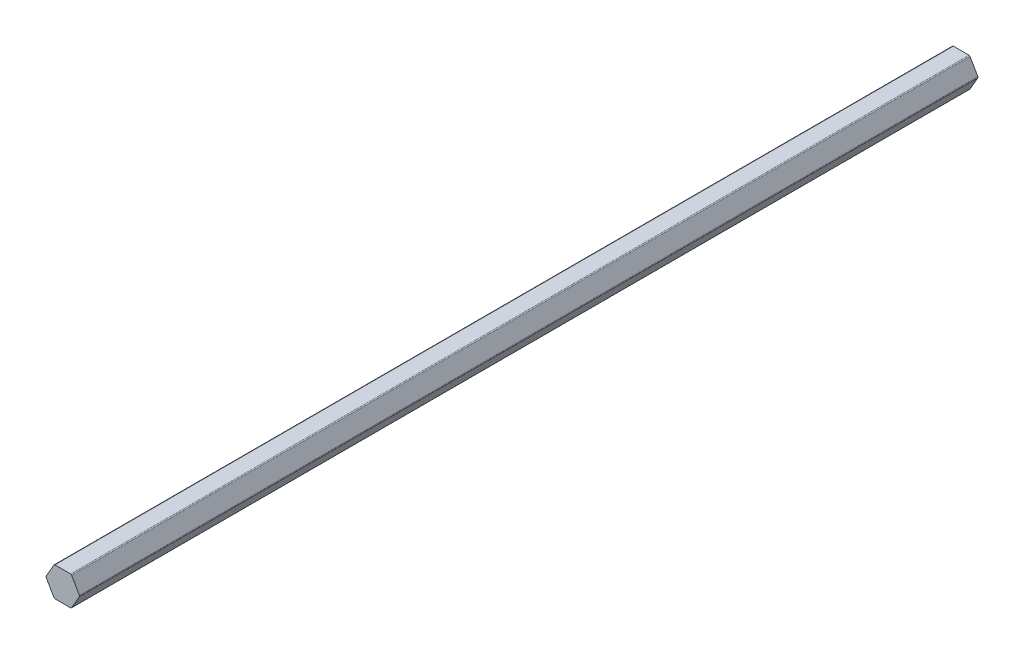
ISO-10303-21;
HEADER;
FILE_DESCRIPTION(('STEP AP214'),'2;1');
FILE_NAME('part.step','',(''),(''),'','','');
FILE_SCHEMA(('AUTOMOTIVE_DESIGN { 1 0 10303 214 1 1 1 1 }'));
ENDSEC;
DATA;
#1=APPLICATION_CONTEXT('core data for automotive mechanical design processes');
#2=APPLICATION_PROTOCOL_DEFINITION('international standard','automotive_design',2000,#1);
#3=PRODUCT_CONTEXT('',#1,'mechanical');
#4=PRODUCT('Part','Part','',(#3));
#5=PRODUCT_RELATED_PRODUCT_CATEGORY('part','',(#4));
#6=PRODUCT_DEFINITION_FORMATION('','',#4);
#7=PRODUCT_DEFINITION_CONTEXT('part definition',#1,'design');
#8=PRODUCT_DEFINITION('design','',#6,#7);
#9=PRODUCT_DEFINITION_SHAPE('','',#8);
#10=(LENGTH_UNIT() NAMED_UNIT(*) SI_UNIT(.MILLI.,.METRE.));
#11=(NAMED_UNIT(*) PLANE_ANGLE_UNIT() SI_UNIT($,.RADIAN.));
#12=(NAMED_UNIT(*) SI_UNIT($,.STERADIAN.) SOLID_ANGLE_UNIT());
#13=UNCERTAINTY_MEASURE_WITH_UNIT(LENGTH_MEASURE(1.E-05),#10,'distance_accuracy_value','');
#14=(GEOMETRIC_REPRESENTATION_CONTEXT(3) GLOBAL_UNCERTAINTY_ASSIGNED_CONTEXT((#13)) GLOBAL_UNIT_ASSIGNED_CONTEXT((#10,
#11,#12)) REPRESENTATION_CONTEXT('',''));
#15=CARTESIAN_POINT('',(0.,0.,0.));
#16=DIRECTION('',(0.,0.,1.));
#17=DIRECTION('',(1.,0.,0.));
#18=AXIS2_PLACEMENT_3D('',#15,#16,#17);
#19=CARTESIAN_POINT('',(3.36554792418709,5.8293,457.2));
#20=DIRECTION('',(0.,0.,-1.));
#21=DIRECTION('',(-1.,0.,0.));
#22=AXIS2_PLACEMENT_3D('',#19,#20,#21);
#23=CYLINDRICAL_SURFACE('',#22,0.508);
#24=CARTESIAN_POINT('',(3.36554792418709,5.8293,-193.675));
#25=DIRECTION('',(0.,0.,-1.));
#26=DIRECTION('',(-1.,0.,0.));
#27=AXIS2_PLACEMENT_3D('',#24,#25,#26);
#28=CIRCLE('',#27,0.508);
#29=CARTESIAN_POINT('',(3.80548882930958,6.0833,-193.675));
#30=VERTEX_POINT('',#29);
#31=CARTESIAN_POINT('',(3.36554792418709,6.3373,-193.675));
#32=VERTEX_POINT('',#31);
#33=EDGE_CURVE('E219',#30,#32,#28,.F.);
#34=ORIENTED_EDGE('',*,*,#33,.T.);
#35=DIRECTION('',(0.,0.,-1.));
#36=VECTOR('',#35,1.);
#37=CARTESIAN_POINT('',(3.36554792418709,6.3373,457.2));
#38=LINE('',#37,#36);
#39=CARTESIAN_POINT('',(3.36554792418709,6.3373,193.675));
#40=VERTEX_POINT('',#39);
#41=EDGE_CURVE('E172',#40,#32,#38,.T.);
#42=ORIENTED_EDGE('',*,*,#41,.F.);
#43=CARTESIAN_POINT('',(3.36554792418709,5.8293,193.675));
#44=DIRECTION('',(0.,0.,1.));
#45=DIRECTION('',(1.,0.,0.));
#46=AXIS2_PLACEMENT_3D('',#43,#44,#45);
#47=CIRCLE('',#46,0.508);
#48=CARTESIAN_POINT('',(3.80548882930958,6.0833,193.675));
#49=VERTEX_POINT('',#48);
#50=EDGE_CURVE('E238',#40,#49,#47,.F.);
#51=ORIENTED_EDGE('',*,*,#50,.T.);
#52=DIRECTION('',(0.,0.,1.));
#53=VECTOR('',#52,1.);
#54=CARTESIAN_POINT('',(3.80548882930958,6.0833,457.2));
#55=LINE('',#54,#53);
#56=EDGE_CURVE('E168',#30,#49,#55,.T.);
#57=ORIENTED_EDGE('',*,*,#56,.F.);
#58=EDGE_LOOP('',(#34,#42,#51,#57));
#59=FACE_BOUND('',#58,.T.);
#60=ADVANCED_FACE('F46',(#59),#23,.T.);
#61=CARTESIAN_POINT('',(-3.36554792418709,5.8293,457.2));
#62=DIRECTION('',(0.,0.,-1.));
#63=DIRECTION('',(-1.,0.,0.));
#64=AXIS2_PLACEMENT_3D('',#61,#62,#63);
#65=CYLINDRICAL_SURFACE('',#64,0.508);
#66=CARTESIAN_POINT('',(-3.36554792418709,5.8293,-193.675));
#67=DIRECTION('',(0.,0.,-1.));
#68=DIRECTION('',(-1.,0.,0.));
#69=AXIS2_PLACEMENT_3D('',#66,#67,#68);
#70=CIRCLE('',#69,0.508);
#71=CARTESIAN_POINT('',(-3.36554792418708,6.3373,-193.675));
#72=VERTEX_POINT('',#71);
#73=CARTESIAN_POINT('',(-3.80548882930958,6.0833,-193.675));
#74=VERTEX_POINT('',#73);
#75=EDGE_CURVE('E210',#72,#74,#70,.F.);
#76=ORIENTED_EDGE('',*,*,#75,.T.);
#77=DIRECTION('',(0.,0.,-1.));
#78=VECTOR('',#77,1.);
#79=CARTESIAN_POINT('',(-3.80548882930958,6.0833,457.2));
#80=LINE('',#79,#78);
#81=CARTESIAN_POINT('',(-3.80548882930958,6.0833,193.675));
#82=VERTEX_POINT('',#81);
#83=EDGE_CURVE('E166',#82,#74,#80,.T.);
#84=ORIENTED_EDGE('',*,*,#83,.F.);
#85=CARTESIAN_POINT('',(-3.36554792418709,5.8293,193.675));
#86=DIRECTION('',(0.,0.,1.));
#87=DIRECTION('',(1.,0.,0.));
#88=AXIS2_PLACEMENT_3D('',#85,#86,#87);
#89=CIRCLE('',#88,0.508);
#90=CARTESIAN_POINT('',(-3.36554792418708,6.3373,193.675));
#91=VERTEX_POINT('',#90);
#92=EDGE_CURVE('E227',#82,#91,#89,.F.);
#93=ORIENTED_EDGE('',*,*,#92,.T.);
#94=DIRECTION('',(0.,0.,1.));
#95=VECTOR('',#94,1.);
#96=CARTESIAN_POINT('',(-3.36554792418709,6.3373,457.2));
#97=LINE('',#96,#95);
#98=EDGE_CURVE('E170',#72,#91,#97,.T.);
#99=ORIENTED_EDGE('',*,*,#98,.F.);
#100=EDGE_LOOP('',(#76,#84,#93,#99));
#101=FACE_BOUND('',#100,.T.);
#102=ADVANCED_FACE('F252',(#101),#65,.T.);
#103=CARTESIAN_POINT('',(6.73109584837417,0.,457.2));
#104=DIRECTION('',(0.,0.,-1.));
#105=DIRECTION('',(-1.,0.,0.));
#106=AXIS2_PLACEMENT_3D('',#103,#104,#105);
#107=CYLINDRICAL_SURFACE('',#106,0.508);
#108=CARTESIAN_POINT('',(6.73109584837417,0.,-193.675));
#109=DIRECTION('',(0.,0.,-1.));
#110=DIRECTION('',(-1.,0.,0.));
#111=AXIS2_PLACEMENT_3D('',#108,#109,#110);
#112=CIRCLE('',#111,0.508);
#113=CARTESIAN_POINT('',(7.17103675349666,-0.254,-193.675));
#114=VERTEX_POINT('',#113);
#115=CARTESIAN_POINT('',(7.17103675349667,0.254000000000004,-193.675));
#116=VERTEX_POINT('',#115);
#117=EDGE_CURVE('E208',#114,#116,#112,.F.);
#118=ORIENTED_EDGE('',*,*,#117,.T.);
#119=DIRECTION('',(0.,0.,-1.));
#120=VECTOR('',#119,1.);
#121=CARTESIAN_POINT('',(7.17103675349666,0.254,457.2));
#122=LINE('',#121,#120);
#123=CARTESIAN_POINT('',(7.17103675349667,0.254000000000004,193.675));
#124=VERTEX_POINT('',#123);
#125=EDGE_CURVE('E171',#124,#116,#122,.T.);
#126=ORIENTED_EDGE('',*,*,#125,.F.);
#127=CARTESIAN_POINT('',(6.73109584837417,0.,193.675));
#128=DIRECTION('',(0.,0.,1.));
#129=DIRECTION('',(1.,0.,0.));
#130=AXIS2_PLACEMENT_3D('',#127,#128,#129);
#131=CIRCLE('',#130,0.508);
#132=CARTESIAN_POINT('',(7.17103675349666,-0.254000000000001,193.675));
#133=VERTEX_POINT('',#132);
#134=EDGE_CURVE('E162',#124,#133,#131,.F.);
#135=ORIENTED_EDGE('',*,*,#134,.T.);
#136=DIRECTION('',(0.,0.,1.));
#137=VECTOR('',#136,1.);
#138=CARTESIAN_POINT('',(7.17103675349667,-0.253999999999996,457.2));
#139=LINE('',#138,#137);
#140=EDGE_CURVE('E183',#114,#133,#139,.T.);
#141=ORIENTED_EDGE('',*,*,#140,.F.);
#142=EDGE_LOOP('',(#118,#126,#135,#141));
#143=FACE_BOUND('',#142,.T.);
#144=ADVANCED_FACE('F286',(#143),#107,.T.);
#145=CARTESIAN_POINT('',(3.36554792418709,-5.8293,457.2));
#146=DIRECTION('',(0.,0.,-1.));
#147=DIRECTION('',(-1.,0.,0.));
#148=AXIS2_PLACEMENT_3D('',#145,#146,#147);
#149=CYLINDRICAL_SURFACE('',#148,0.508);
#150=CARTESIAN_POINT('',(3.36554792418709,-5.8293,-193.675));
#151=DIRECTION('',(0.,0.,-1.));
#152=DIRECTION('',(-1.,0.,0.));
#153=AXIS2_PLACEMENT_3D('',#150,#151,#152);
#154=CIRCLE('',#153,0.508);
#155=CARTESIAN_POINT('',(3.36554792418709,-6.3373,-193.675));
#156=VERTEX_POINT('',#155);
#157=CARTESIAN_POINT('',(3.80548882930958,-6.0833,-193.675));
#158=VERTEX_POINT('',#157);
#159=EDGE_CURVE('E202',#156,#158,#154,.F.);
#160=ORIENTED_EDGE('',*,*,#159,.T.);
#161=DIRECTION('',(0.,0.,-1.));
#162=VECTOR('',#161,1.);
#163=CARTESIAN_POINT('',(3.80548882930958,-6.0833,457.2));
#164=LINE('',#163,#162);
#165=CARTESIAN_POINT('',(3.80548882930958,-6.0833,193.675));
#166=VERTEX_POINT('',#165);
#167=EDGE_CURVE('E159',#166,#158,#164,.T.);
#168=ORIENTED_EDGE('',*,*,#167,.F.);
#169=CARTESIAN_POINT('',(3.36554792418709,-5.8293,193.675));
#170=DIRECTION('',(0.,0.,1.));
#171=DIRECTION('',(1.,0.,0.));
#172=AXIS2_PLACEMENT_3D('',#169,#170,#171);
#173=CIRCLE('',#172,0.508);
#174=CARTESIAN_POINT('',(3.36554792418709,-6.3373,193.675));
#175=VERTEX_POINT('',#174);
#176=EDGE_CURVE('E200',#166,#175,#173,.F.);
#177=ORIENTED_EDGE('',*,*,#176,.T.);
#178=DIRECTION('',(0.,0.,1.));
#179=VECTOR('',#178,1.);
#180=CARTESIAN_POINT('',(3.36554792418709,-6.3373,457.2));
#181=LINE('',#180,#179);
#182=EDGE_CURVE('E178',#156,#175,#181,.T.);
#183=ORIENTED_EDGE('',*,*,#182,.F.);
#184=EDGE_LOOP('',(#160,#168,#177,#183));
#185=FACE_BOUND('',#184,.T.);
#186=ADVANCED_FACE('F198',(#185),#149,.T.);
#187=CARTESIAN_POINT('',(-6.73109584837417,0.,457.2));
#188=DIRECTION('',(0.,0.,-1.));
#189=DIRECTION('',(-1.,0.,0.));
#190=AXIS2_PLACEMENT_3D('',#187,#188,#189);
#191=CYLINDRICAL_SURFACE('',#190,0.508);
#192=DIRECTION('',(0.,0.,1.));
#193=VECTOR('',#192,1.);
#194=CARTESIAN_POINT('',(-7.17103675349666,0.253999999999995,457.2));
#195=LINE('',#194,#193);
#196=CARTESIAN_POINT('',(-7.17103675349667,0.253999999999998,-193.675));
#197=VERTEX_POINT('',#196);
#198=CARTESIAN_POINT('',(-7.17103675349666,0.253999999999999,193.675));
#199=VERTEX_POINT('',#198);
#200=EDGE_CURVE('E152',#197,#199,#195,.T.);
#201=ORIENTED_EDGE('',*,*,#200,.F.);
#202=CARTESIAN_POINT('',(-6.73109584837417,0.,-193.675));
#203=DIRECTION('',(0.,0.,-1.));
#204=DIRECTION('',(-1.,0.,0.));
#205=AXIS2_PLACEMENT_3D('',#202,#203,#204);
#206=CIRCLE('',#205,0.508);
#207=CARTESIAN_POINT('',(-7.23909584837417,0.,-193.675));
#208=VERTEX_POINT('',#207);
#209=EDGE_CURVE('E141',#197,#208,#206,.F.);
#210=ORIENTED_EDGE('',*,*,#209,.T.);
#211=DIRECTION('',(0.,0.,-1.));
#212=VECTOR('',#211,1.);
#213=CARTESIAN_POINT('',(-7.23909584837417,0.,457.2));
#214=LINE('',#213,#212);
#215=CARTESIAN_POINT('',(-7.23909584837417,0.,193.675));
#216=VERTEX_POINT('',#215);
#217=EDGE_CURVE('E151',#216,#208,#214,.T.);
#218=ORIENTED_EDGE('',*,*,#217,.F.);
#219=CARTESIAN_POINT('',(-6.73109584837417,0.,193.675));
#220=DIRECTION('',(0.,0.,1.));
#221=DIRECTION('',(1.,0.,0.));
#222=AXIS2_PLACEMENT_3D('',#219,#220,#221);
#223=CIRCLE('',#222,0.508);
#224=EDGE_CURVE('E68',#216,#199,#223,.F.);
#225=ORIENTED_EDGE('',*,*,#224,.T.);
#226=EDGE_LOOP('',(#201,#210,#218,#225));
#227=FACE_BOUND('',#226,.T.);
#228=ADVANCED_FACE('F150',(#227),#191,.T.);
#229=CARTESIAN_POINT('',(-3.36554792418708,-5.8293,457.2));
#230=DIRECTION('',(0.,0.,-1.));
#231=DIRECTION('',(-1.,0.,0.));
#232=AXIS2_PLACEMENT_3D('',#229,#230,#231);
#233=CYLINDRICAL_SURFACE('',#232,0.508);
#234=CARTESIAN_POINT('',(-3.36554792418708,-5.8293,-193.675));
#235=DIRECTION('',(0.,0.,-1.));
#236=DIRECTION('',(-1.,0.,0.));
#237=AXIS2_PLACEMENT_3D('',#234,#235,#236);
#238=CIRCLE('',#237,0.508);
#239=CARTESIAN_POINT('',(-3.80548882930958,-6.0833,-193.675));
#240=VERTEX_POINT('',#239);
#241=CARTESIAN_POINT('',(-3.36554792418708,-6.3373,-193.675));
#242=VERTEX_POINT('',#241);
#243=EDGE_CURVE('E154',#240,#242,#238,.F.);
#244=ORIENTED_EDGE('',*,*,#243,.T.);
#245=DIRECTION('',(0.,0.,-1.));
#246=VECTOR('',#245,1.);
#247=CARTESIAN_POINT('',(-3.36554792418708,-6.3373,457.2));
#248=LINE('',#247,#246);
#249=CARTESIAN_POINT('',(-3.36554792418708,-6.3373,193.675));
#250=VERTEX_POINT('',#249);
#251=EDGE_CURVE('E175',#250,#242,#248,.T.);
#252=ORIENTED_EDGE('',*,*,#251,.F.);
#253=CARTESIAN_POINT('',(-3.36554792418708,-5.8293,193.675));
#254=DIRECTION('',(0.,0.,1.));
#255=DIRECTION('',(1.,0.,0.));
#256=AXIS2_PLACEMENT_3D('',#253,#254,#255);
#257=CIRCLE('',#256,0.508);
#258=CARTESIAN_POINT('',(-3.80548882930958,-6.0833,193.675));
#259=VERTEX_POINT('',#258);
#260=EDGE_CURVE('E224',#250,#259,#257,.F.);
#261=ORIENTED_EDGE('',*,*,#260,.T.);
#262=DIRECTION('',(0.,0.,1.));
#263=VECTOR('',#262,1.);
#264=CARTESIAN_POINT('',(-3.80548882930957,-6.0833,457.2));
#265=LINE('',#264,#263);
#266=EDGE_CURVE('E179',#240,#259,#265,.T.);
#267=ORIENTED_EDGE('',*,*,#266,.F.);
#268=EDGE_LOOP('',(#244,#252,#261,#267));
#269=FACE_BOUND('',#268,.T.);
#270=ADVANCED_FACE('F262',(#269),#233,.T.);
#271=CARTESIAN_POINT('',(-3.6588418609354,-6.3373,457.2));
#272=DIRECTION('',(0.,1.,0.));
#273=DIRECTION('',(1.,0.,0.));
#274=AXIS2_PLACEMENT_3D('',#271,#272,#273);
#275=PLANE('',#274);
#276=DIRECTION('',(-1.,0.,0.));
#277=VECTOR('',#276,1.);
#278=CARTESIAN_POINT('',(-3.6588418609354,-6.3373,-193.675));
#279=LINE('',#278,#277);
#280=EDGE_CURVE('E205',#156,#242,#279,.T.);
#281=ORIENTED_EDGE('',*,*,#280,.F.);
#282=ORIENTED_EDGE('',*,*,#182,.T.);
#283=DIRECTION('',(1.,0.,0.));
#284=VECTOR('',#283,1.);
#285=CARTESIAN_POINT('',(-3.6588418609354,-6.3373,193.675));
#286=LINE('',#285,#284);
#287=EDGE_CURVE('E236',#250,#175,#286,.T.);
#288=ORIENTED_EDGE('',*,*,#287,.F.);
#289=ORIENTED_EDGE('',*,*,#251,.T.);
#290=EDGE_LOOP('',(#281,#282,#288,#289));
#291=FACE_BOUND('',#290,.T.);
#292=ADVANCED_FACE('F265',(#291),#275,.F.);
#293=CARTESIAN_POINT('',(-7.31768372187083,0.,457.2));
#294=DIRECTION('',(0.866025403784438,0.5,0.));
#295=DIRECTION('',(0.,0.,-1.));
#296=AXIS2_PLACEMENT_3D('',#293,#294,#295);
#297=PLANE('',#296);
#298=DIRECTION('',(-0.5,0.866025403784438,0.));
#299=VECTOR('',#298,1.);
#300=CARTESIAN_POINT('',(-7.31768372187083,0.,-193.675));
#301=LINE('',#300,#299);
#302=CARTESIAN_POINT('',(-7.17103675349666,-0.254000000000004,-193.675));
#303=VERTEX_POINT('',#302);
#304=EDGE_CURVE('E61',#240,#303,#301,.T.);
#305=ORIENTED_EDGE('',*,*,#304,.F.);
#306=ORIENTED_EDGE('',*,*,#266,.T.);
#307=DIRECTION('',(0.5,-0.866025403784438,0.));
#308=VECTOR('',#307,1.);
#309=CARTESIAN_POINT('',(-7.31768372187083,0.,193.675));
#310=LINE('',#309,#308);
#311=CARTESIAN_POINT('',(-7.17103675349666,-0.254000000000007,193.675));
#312=VERTEX_POINT('',#311);
#313=EDGE_CURVE('E221',#312,#259,#310,.T.);
#314=ORIENTED_EDGE('',*,*,#313,.F.);
#315=DIRECTION('',(0.,0.,-1.));
#316=VECTOR('',#315,1.);
#317=CARTESIAN_POINT('',(-7.17103675349666,-0.254000000000004,457.2));
#318=LINE('',#317,#316);
#319=EDGE_CURVE('E156',#312,#303,#318,.T.);
#320=ORIENTED_EDGE('',*,*,#319,.T.);
#321=EDGE_LOOP('',(#305,#306,#314,#320));
#322=FACE_BOUND('',#321,.T.);
#323=ADVANCED_FACE('F269',(#322),#297,.F.);
#324=CARTESIAN_POINT('',(-3.65884186093541,6.3373,457.2));
#325=DIRECTION('',(0.866025403784439,-0.5,0.));
#326=DIRECTION('',(0.,0.,-1.));
#327=AXIS2_PLACEMENT_3D('',#324,#325,#326);
#328=PLANE('',#327);
#329=DIRECTION('',(0.5,0.866025403784439,0.));
#330=VECTOR('',#329,1.);
#331=CARTESIAN_POINT('',(-3.65884186093541,6.3373,-193.675));
#332=LINE('',#331,#330);
#333=EDGE_CURVE('E153',#197,#74,#332,.T.);
#334=ORIENTED_EDGE('',*,*,#333,.F.);
#335=ORIENTED_EDGE('',*,*,#200,.T.);
#336=DIRECTION('',(-0.5,-0.866025403784439,0.));
#337=VECTOR('',#336,1.);
#338=CARTESIAN_POINT('',(-3.65884186093541,6.3373,193.675));
#339=LINE('',#338,#337);
#340=EDGE_CURVE('E228',#82,#199,#339,.T.);
#341=ORIENTED_EDGE('',*,*,#340,.F.);
#342=ORIENTED_EDGE('',*,*,#83,.T.);
#343=EDGE_LOOP('',(#334,#335,#341,#342));
#344=FACE_BOUND('',#343,.T.);
#345=ADVANCED_FACE('F250',(#344),#328,.F.);
#346=CARTESIAN_POINT('',(3.65884186093541,6.3373,457.2));
#347=DIRECTION('',(0.,-1.,0.));
#348=DIRECTION('',(0.,0.,-1.));
#349=AXIS2_PLACEMENT_3D('',#346,#347,#348);
#350=PLANE('',#349);
#351=DIRECTION('',(1.,0.,0.));
#352=VECTOR('',#351,1.);
#353=CARTESIAN_POINT('',(3.65884186093541,6.3373,-193.675));
#354=LINE('',#353,#352);
#355=EDGE_CURVE('E216',#72,#32,#354,.T.);
#356=ORIENTED_EDGE('',*,*,#355,.F.);
#357=ORIENTED_EDGE('',*,*,#98,.T.);
#358=DIRECTION('',(-1.,0.,0.));
#359=VECTOR('',#358,1.);
#360=CARTESIAN_POINT('',(3.65884186093541,6.3373,193.675));
#361=LINE('',#360,#359);
#362=EDGE_CURVE('E233',#40,#91,#361,.T.);
#363=ORIENTED_EDGE('',*,*,#362,.F.);
#364=ORIENTED_EDGE('',*,*,#41,.T.);
#365=EDGE_LOOP('',(#356,#357,#363,#364));
#366=FACE_BOUND('',#365,.T.);
#367=ADVANCED_FACE('F276',(#366),#350,.F.);
#368=CARTESIAN_POINT('',(7.31768372187083,0.,457.2));
#369=DIRECTION('',(-0.866025403784439,-0.5,0.));
#370=DIRECTION('',(-0.5,0.866025403784439,0.));
#371=AXIS2_PLACEMENT_3D('',#368,#369,#370);
#372=PLANE('',#371);
#373=DIRECTION('',(0.5,-0.866025403784439,0.));
#374=VECTOR('',#373,1.);
#375=CARTESIAN_POINT('',(7.31768372187083,0.,-193.675));
#376=LINE('',#375,#374);
#377=EDGE_CURVE('E214',#30,#116,#376,.T.);
#378=ORIENTED_EDGE('',*,*,#377,.F.);
#379=ORIENTED_EDGE('',*,*,#56,.T.);
#380=DIRECTION('',(-0.5,0.866025403784439,0.));
#381=VECTOR('',#380,1.);
#382=CARTESIAN_POINT('',(7.31768372187083,0.,193.675));
#383=LINE('',#382,#381);
#384=EDGE_CURVE('E240',#124,#49,#383,.T.);
#385=ORIENTED_EDGE('',*,*,#384,.F.);
#386=ORIENTED_EDGE('',*,*,#125,.T.);
#387=EDGE_LOOP('',(#378,#379,#385,#386));
#388=FACE_BOUND('',#387,.T.);
#389=ADVANCED_FACE('F294',(#388),#372,.F.);
#390=CARTESIAN_POINT('',(3.65884186093541,-6.3373,457.2));
#391=DIRECTION('',(-0.866025403784439,0.5,0.));
#392=DIRECTION('',(0.,0.,1.));
#393=AXIS2_PLACEMENT_3D('',#390,#391,#392);
#394=PLANE('',#393);
#395=DIRECTION('',(-0.5,-0.866025403784439,0.));
#396=VECTOR('',#395,1.);
#397=CARTESIAN_POINT('',(3.65884186093541,-6.3373,-193.675));
#398=LINE('',#397,#396);
#399=EDGE_CURVE('E194',#114,#158,#398,.T.);
#400=ORIENTED_EDGE('',*,*,#399,.F.);
#401=ORIENTED_EDGE('',*,*,#140,.T.);
#402=DIRECTION('',(0.5,0.866025403784439,0.));
#403=VECTOR('',#402,1.);
#404=CARTESIAN_POINT('',(3.65884186093541,-6.3373,193.675));
#405=LINE('',#404,#403);
#406=EDGE_CURVE('E157',#166,#133,#405,.T.);
#407=ORIENTED_EDGE('',*,*,#406,.F.);
#408=ORIENTED_EDGE('',*,*,#167,.T.);
#409=EDGE_LOOP('',(#400,#401,#407,#408));
#410=FACE_BOUND('',#409,.T.);
#411=ADVANCED_FACE('F192',(#410),#394,.F.);
#412=CARTESIAN_POINT('',(-6.73109584837417,0.,457.2));
#413=DIRECTION('',(0.,0.,-1.));
#414=DIRECTION('',(-1.,0.,0.));
#415=AXIS2_PLACEMENT_3D('',#412,#413,#414);
#416=CYLINDRICAL_SURFACE('',#415,0.508);
#417=ORIENTED_EDGE('',*,*,#217,.T.);
#418=CARTESIAN_POINT('',(-6.73109584837417,0.,-193.675));
#419=DIRECTION('',(0.,0.,-1.));
#420=DIRECTION('',(-1.,0.,0.));
#421=AXIS2_PLACEMENT_3D('',#418,#419,#420);
#422=CIRCLE('',#421,0.508);
#423=EDGE_CURVE('E11',#208,#303,#422,.F.);
#424=ORIENTED_EDGE('',*,*,#423,.T.);
#425=ORIENTED_EDGE('',*,*,#319,.F.);
#426=CARTESIAN_POINT('',(-6.73109584837417,0.,193.675));
#427=DIRECTION('',(0.,0.,1.));
#428=DIRECTION('',(1.,0.,0.));
#429=AXIS2_PLACEMENT_3D('',#426,#427,#428);
#430=CIRCLE('',#429,0.508);
#431=EDGE_CURVE('E54',#312,#216,#430,.F.);
#432=ORIENTED_EDGE('',*,*,#431,.T.);
#433=EDGE_LOOP('',(#417,#424,#425,#432));
#434=FACE_BOUND('',#433,.T.);
#435=ADVANCED_FACE('F48',(#434),#416,.T.);
#436=CARTESIAN_POINT('',(0.,0.,193.675));
#437=DIRECTION('',(0.,0.,1.));
#438=DIRECTION('',(1.,0.,0.));
#439=AXIS2_PLACEMENT_3D('',#436,#437,#438);
#440=PLANE('',#439);
#441=ORIENTED_EDGE('',*,*,#406,.T.);
#442=ORIENTED_EDGE('',*,*,#134,.F.);
#443=ORIENTED_EDGE('',*,*,#384,.T.);
#444=ORIENTED_EDGE('',*,*,#50,.F.);
#445=ORIENTED_EDGE('',*,*,#362,.T.);
#446=ORIENTED_EDGE('',*,*,#92,.F.);
#447=ORIENTED_EDGE('',*,*,#340,.T.);
#448=ORIENTED_EDGE('',*,*,#224,.F.);
#449=ORIENTED_EDGE('',*,*,#431,.F.);
#450=ORIENTED_EDGE('',*,*,#313,.T.);
#451=ORIENTED_EDGE('',*,*,#260,.F.);
#452=ORIENTED_EDGE('',*,*,#287,.T.);
#453=ORIENTED_EDGE('',*,*,#176,.F.);
#454=EDGE_LOOP('',(#441,#442,#443,#444,#445,#446,#447,#448,#449,#450,#451,#452,#453));
#455=FACE_BOUND('',#454,.T.);
#456=ADVANCED_FACE('F266',(#455),#440,.T.);
#457=CARTESIAN_POINT('',(0.,0.,-193.675));
#458=DIRECTION('',(0.,0.,-1.));
#459=DIRECTION('',(-1.,0.,0.));
#460=AXIS2_PLACEMENT_3D('',#457,#458,#459);
#461=PLANE('',#460);
#462=ORIENTED_EDGE('',*,*,#33,.F.);
#463=ORIENTED_EDGE('',*,*,#377,.T.);
#464=ORIENTED_EDGE('',*,*,#117,.F.);
#465=ORIENTED_EDGE('',*,*,#399,.T.);
#466=ORIENTED_EDGE('',*,*,#159,.F.);
#467=ORIENTED_EDGE('',*,*,#280,.T.);
#468=ORIENTED_EDGE('',*,*,#243,.F.);
#469=ORIENTED_EDGE('',*,*,#304,.T.);
#470=ORIENTED_EDGE('',*,*,#423,.F.);
#471=ORIENTED_EDGE('',*,*,#209,.F.);
#472=ORIENTED_EDGE('',*,*,#333,.T.);
#473=ORIENTED_EDGE('',*,*,#75,.F.);
#474=ORIENTED_EDGE('',*,*,#355,.T.);
#475=EDGE_LOOP('',(#462,#463,#464,#465,#466,#467,#468,#469,#470,#471,#472,#473,#474));
#476=FACE_BOUND('',#475,.T.);
#477=ADVANCED_FACE('F139',(#476),#461,.T.);
#478=CLOSED_SHELL('',(#60,#102,#144,#186,#228,#270,#292,#323,#345,#367,#389,#411,#435,#456,#477));
#479=MANIFOLD_SOLID_BREP('B2',#478);
#480=ADVANCED_BREP_SHAPE_REPRESENTATION('',(#18,#479),#14);
#481=SHAPE_DEFINITION_REPRESENTATION(#9,#480);
ENDSEC;
END-ISO-10303-21;
